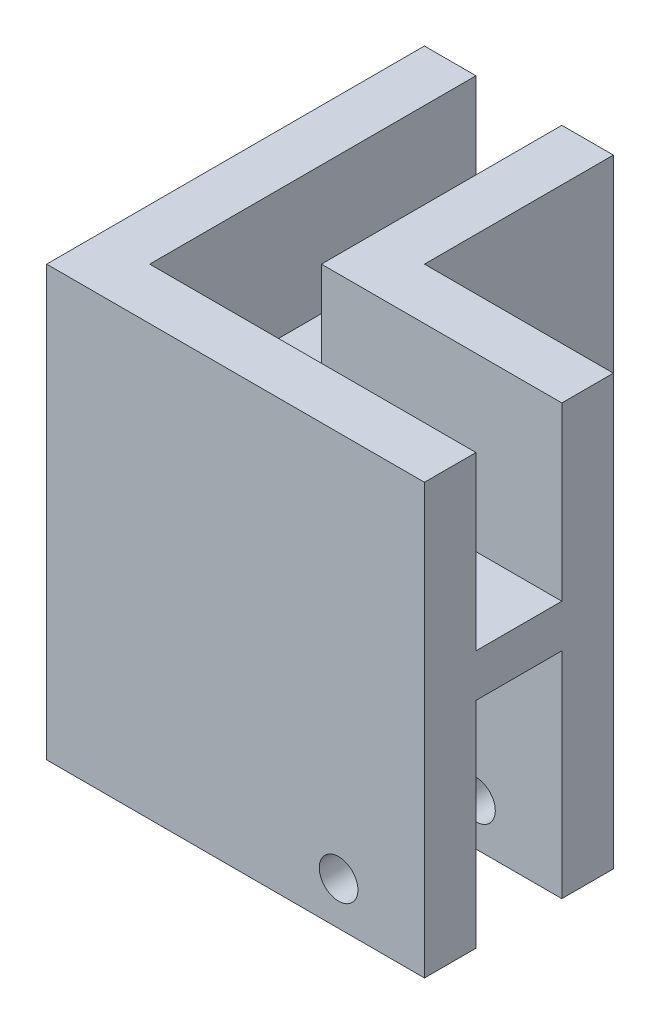
ISO-10303-21;
HEADER;
FILE_DESCRIPTION(('STEP AP214'),'2;1');
FILE_NAME('part.step','',(''),(''),'','','');
FILE_SCHEMA(('AUTOMOTIVE_DESIGN { 1 0 10303 214 1 1 1 1 }'));
ENDSEC;
DATA;
#1=APPLICATION_CONTEXT('core data for automotive mechanical design processes');
#2=APPLICATION_PROTOCOL_DEFINITION('international standard','automotive_design',2000,#1);
#3=PRODUCT_CONTEXT('',#1,'mechanical');
#4=PRODUCT('Part','Part','',(#3));
#5=PRODUCT_RELATED_PRODUCT_CATEGORY('part','',(#4));
#6=PRODUCT_DEFINITION_FORMATION('','',#4);
#7=PRODUCT_DEFINITION_CONTEXT('part definition',#1,'design');
#8=PRODUCT_DEFINITION('design','',#6,#7);
#9=PRODUCT_DEFINITION_SHAPE('','',#8);
#10=(LENGTH_UNIT() NAMED_UNIT(*) SI_UNIT(.MILLI.,.METRE.));
#11=(NAMED_UNIT(*) PLANE_ANGLE_UNIT() SI_UNIT($,.RADIAN.));
#12=(NAMED_UNIT(*) SI_UNIT($,.STERADIAN.) SOLID_ANGLE_UNIT());
#13=UNCERTAINTY_MEASURE_WITH_UNIT(LENGTH_MEASURE(1.E-05),#10,'distance_accuracy_value','');
#14=(GEOMETRIC_REPRESENTATION_CONTEXT(3) GLOBAL_UNCERTAINTY_ASSIGNED_CONTEXT((#13)) GLOBAL_UNIT_ASSIGNED_CONTEXT((#10,
#11,#12)) REPRESENTATION_CONTEXT('',''));
#15=CARTESIAN_POINT('',(0.,0.,0.));
#16=DIRECTION('',(0.,0.,1.));
#17=DIRECTION('',(1.,0.,0.));
#18=AXIS2_PLACEMENT_3D('',#15,#16,#17);
#19=CARTESIAN_POINT('',(-10.,10.,28.));
#20=DIRECTION('',(0.,-1.,0.));
#21=DIRECTION('',(0.,0.,-1.));
#22=AXIS2_PLACEMENT_3D('',#19,#20,#21);
#23=PLANE('',#22);
#24=DIRECTION('',(0.,0.,1.));
#25=VECTOR('',#24,1.);
#26=CARTESIAN_POINT('',(0.,10.,38.));
#27=LINE('',#26,#25);
#28=CARTESIAN_POINT('',(0.,10.,28.));
#29=VERTEX_POINT('',#28);
#30=CARTESIAN_POINT('',(0.,10.,38.));
#31=VERTEX_POINT('',#30);
#32=EDGE_CURVE('E302',#29,#31,#27,.T.);
#33=ORIENTED_EDGE('',*,*,#32,.F.);
#34=DIRECTION('',(0.,0.,-1.));
#35=VECTOR('',#34,1.);
#36=CARTESIAN_POINT('',(0.,10.,28.));
#37=LINE('',#36,#35);
#38=CARTESIAN_POINT('',(0.,10.,0.));
#39=VERTEX_POINT('',#38);
#40=EDGE_CURVE('E176',#29,#39,#37,.T.);
#41=ORIENTED_EDGE('',*,*,#40,.T.);
#42=DIRECTION('',(-1.,0.,0.));
#43=VECTOR('',#42,1.);
#44=CARTESIAN_POINT('',(-10.,10.,0.));
#45=LINE('',#44,#43);
#46=CARTESIAN_POINT('',(-10.,10.,0.));
#47=VERTEX_POINT('',#46);
#48=EDGE_CURVE('E149',#39,#47,#45,.T.);
#49=ORIENTED_EDGE('',*,*,#48,.T.);
#50=DIRECTION('',(0.,0.,-1.));
#51=VECTOR('',#50,1.);
#52=CARTESIAN_POINT('',(-10.,10.,28.));
#53=LINE('',#52,#51);
#54=CARTESIAN_POINT('',(-10.,10.,38.));
#55=VERTEX_POINT('',#54);
#56=EDGE_CURVE('E173',#55,#47,#53,.T.);
#57=ORIENTED_EDGE('',*,*,#56,.F.);
#58=DIRECTION('',(1.,0.,0.));
#59=VECTOR('',#58,1.);
#60=CARTESIAN_POINT('',(-10.,10.,38.));
#61=LINE('',#60,#59);
#62=EDGE_CURVE('E264',#55,#31,#61,.T.);
#63=ORIENTED_EDGE('',*,*,#62,.T.);
#64=EDGE_LOOP('',(#33,#41,#49,#57,#63));
#65=FACE_BOUND('',#64,.T.);
#66=ADVANCED_FACE('F37',(#65),#23,.F.);
#67=CARTESIAN_POINT('',(6.,25.,28.));
#68=DIRECTION('',(-1.,0.,0.));
#69=DIRECTION('',(0.,-1.,0.));
#70=AXIS2_PLACEMENT_3D('',#67,#68,#69);
#71=PLANE('',#70);
#72=CARTESIAN_POINT('',(6.00000000000001,-20.,10.));
#73=DIRECTION('',(-1.,0.,0.));
#74=DIRECTION('',(0.,-1.,0.));
#75=AXIS2_PLACEMENT_3D('',#72,#73,#74);
#76=CIRCLE('',#75,2.24999999999999);
#77=CARTESIAN_POINT('',(6.00000000000001,-22.25,10.));
#78=VERTEX_POINT('',#77);
#79=EDGE_CURVE('E196',#78,#78,#76,.T.);
#80=ORIENTED_EDGE('',*,*,#79,.T.);
#81=EDGE_LOOP('',(#80));
#82=FACE_BOUND('',#81,.T.);
#83=DIRECTION('',(0.,1.,0.));
#84=VECTOR('',#83,1.);
#85=CARTESIAN_POINT('',(6.,25.,22.));
#86=LINE('',#85,#84);
#87=CARTESIAN_POINT('',(6.,-25.,22.));
#88=VERTEX_POINT('',#87);
#89=CARTESIAN_POINT('',(6.,25.,22.));
#90=VERTEX_POINT('',#89);
#91=EDGE_CURVE('E54',#88,#90,#86,.T.);
#92=ORIENTED_EDGE('',*,*,#91,.F.);
#93=DIRECTION('',(0.,0.,-1.));
#94=VECTOR('',#93,1.);
#95=CARTESIAN_POINT('',(6.,-25.,28.));
#96=LINE('',#95,#94);
#97=CARTESIAN_POINT('',(6.,-25.,0.));
#98=VERTEX_POINT('',#97);
#99=EDGE_CURVE('E184',#88,#98,#96,.T.);
#100=ORIENTED_EDGE('',*,*,#99,.T.);
#101=DIRECTION('',(0.,1.,0.));
#102=VECTOR('',#101,1.);
#103=CARTESIAN_POINT('',(6.,25.,0.));
#104=LINE('',#103,#102);
#105=CARTESIAN_POINT('',(6.,25.,0.));
#106=VERTEX_POINT('',#105);
#107=EDGE_CURVE('E135',#98,#106,#104,.T.);
#108=ORIENTED_EDGE('',*,*,#107,.T.);
#109=DIRECTION('',(0.,0.,-1.));
#110=VECTOR('',#109,1.);
#111=CARTESIAN_POINT('',(6.,25.,28.));
#112=LINE('',#111,#110);
#113=EDGE_CURVE('E182',#90,#106,#112,.T.);
#114=ORIENTED_EDGE('',*,*,#113,.F.);
#115=EDGE_LOOP('',(#92,#100,#108,#114));
#116=FACE_BOUND('',#115,.T.);
#117=ADVANCED_FACE('F431',(#82,#116),#71,.F.);
#118=CARTESIAN_POINT('',(0.,0.,28.));
#119=DIRECTION('',(0.,0.,1.));
#120=DIRECTION('',(1.,0.,0.));
#121=AXIS2_PLACEMENT_3D('',#118,#119,#120);
#122=PLANE('',#121);
#123=DIRECTION('',(0.,1.,0.));
#124=VECTOR('',#123,1.);
#125=CARTESIAN_POINT('',(0.,10.,28.));
#126=LINE('',#125,#124);
#127=CARTESIAN_POINT('',(0.,5.,28.));
#128=VERTEX_POINT('',#127);
#129=EDGE_CURVE('E290',#128,#29,#126,.T.);
#130=ORIENTED_EDGE('',*,*,#129,.F.);
#131=DIRECTION('',(-1.,0.,0.));
#132=VECTOR('',#131,1.);
#133=CARTESIAN_POINT('',(28.,5.00000000000001,28.));
#134=LINE('',#133,#132);
#135=CARTESIAN_POINT('',(28.,5.00000000000001,28.));
#136=VERTEX_POINT('',#135);
#137=EDGE_CURVE('E247',#136,#128,#134,.T.);
#138=ORIENTED_EDGE('',*,*,#137,.F.);
#139=DIRECTION('',(0.,-1.,0.));
#140=VECTOR('',#139,1.);
#141=CARTESIAN_POINT('',(28.,5.00000000000001,28.));
#142=LINE('',#141,#140);
#143=CARTESIAN_POINT('',(28.,25.,28.));
#144=VERTEX_POINT('',#143);
#145=EDGE_CURVE('E225',#144,#136,#142,.T.);
#146=ORIENTED_EDGE('',*,*,#145,.F.);
#147=DIRECTION('',(-1.,0.,0.));
#148=VECTOR('',#147,1.);
#149=CARTESIAN_POINT('',(0.,25.,28.));
#150=LINE('',#149,#148);
#151=CARTESIAN_POINT('',(0.,25.,28.));
#152=VERTEX_POINT('',#151);
#153=EDGE_CURVE('E63',#144,#152,#150,.T.);
#154=ORIENTED_EDGE('',*,*,#153,.T.);
#155=DIRECTION('',(0.,-1.,0.));
#156=VECTOR('',#155,1.);
#157=CARTESIAN_POINT('',(0.,10.,28.));
#158=LINE('',#157,#156);
#159=EDGE_CURVE('E126',#152,#29,#158,.T.);
#160=ORIENTED_EDGE('',*,*,#159,.T.);
#161=EDGE_LOOP('',(#130,#138,#146,#154,#160));
#162=FACE_BOUND('',#161,.T.);
#163=ADVANCED_FACE('F286',(#162),#122,.T.);
#164=CARTESIAN_POINT('',(0.,-25.,28.));
#165=DIRECTION('',(1.,0.,0.));
#166=DIRECTION('',(0.,0.,-1.));
#167=AXIS2_PLACEMENT_3D('',#164,#165,#166);
#168=PLANE('',#167);
#169=CARTESIAN_POINT('',(0.,-20.,10.));
#170=DIRECTION('',(1.,0.,0.));
#171=DIRECTION('',(0.,0.,-1.));
#172=AXIS2_PLACEMENT_3D('',#169,#170,#171);
#173=CIRCLE('',#172,2.24999999999999);
#174=CARTESIAN_POINT('',(0.,-20.,7.75000000000001));
#175=VERTEX_POINT('',#174);
#176=EDGE_CURVE('E201',#175,#175,#173,.T.);
#177=ORIENTED_EDGE('',*,*,#176,.T.);
#178=EDGE_LOOP('',(#177));
#179=FACE_BOUND('',#178,.T.);
#180=DIRECTION('',(0.,-1.,0.));
#181=VECTOR('',#180,1.);
#182=CARTESIAN_POINT('',(0.,-25.,0.));
#183=LINE('',#182,#181);
#184=CARTESIAN_POINT('',(0.,0.,0.));
#185=VERTEX_POINT('',#184);
#186=CARTESIAN_POINT('',(0.,-25.,0.));
#187=VERTEX_POINT('',#186);
#188=EDGE_CURVE('E124',#185,#187,#183,.T.);
#189=ORIENTED_EDGE('',*,*,#188,.T.);
#190=DIRECTION('',(0.,0.,-1.));
#191=VECTOR('',#190,1.);
#192=CARTESIAN_POINT('',(0.,-25.,28.));
#193=LINE('',#192,#191);
#194=CARTESIAN_POINT('',(0.,-25.,28.));
#195=VERTEX_POINT('',#194);
#196=EDGE_CURVE('E46',#195,#187,#193,.T.);
#197=ORIENTED_EDGE('',*,*,#196,.F.);
#198=DIRECTION('',(0.,-1.,0.));
#199=VECTOR('',#198,1.);
#200=CARTESIAN_POINT('',(0.,-25.,28.));
#201=LINE('',#200,#199);
#202=CARTESIAN_POINT('',(0.,0.,28.));
#203=VERTEX_POINT('',#202);
#204=EDGE_CURVE('E118',#203,#195,#201,.T.);
#205=ORIENTED_EDGE('',*,*,#204,.F.);
#206=DIRECTION('',(0.,0.,-1.));
#207=VECTOR('',#206,1.);
#208=CARTESIAN_POINT('',(0.,0.,28.));
#209=LINE('',#208,#207);
#210=EDGE_CURVE('E110',#203,#185,#209,.T.);
#211=ORIENTED_EDGE('',*,*,#210,.T.);
#212=EDGE_LOOP('',(#189,#197,#205,#211));
#213=FACE_BOUND('',#212,.T.);
#214=ADVANCED_FACE('F39',(#179,#213),#168,.F.);
#215=CARTESIAN_POINT('',(6.,-25.,28.));
#216=DIRECTION('',(0.,1.,0.));
#217=DIRECTION('',(0.,0.,1.));
#218=AXIS2_PLACEMENT_3D('',#215,#216,#217);
#219=PLANE('',#218);
#220=DIRECTION('',(1.,0.,0.));
#221=VECTOR('',#220,1.);
#222=CARTESIAN_POINT('',(6.,-25.,0.));
#223=LINE('',#222,#221);
#224=EDGE_CURVE('E131',#187,#98,#223,.T.);
#225=ORIENTED_EDGE('',*,*,#224,.T.);
#226=ORIENTED_EDGE('',*,*,#99,.F.);
#227=DIRECTION('',(-1.,0.,0.));
#228=VECTOR('',#227,1.);
#229=CARTESIAN_POINT('',(28.,-25.,22.));
#230=LINE('',#229,#228);
#231=CARTESIAN_POINT('',(28.,-25.,22.));
#232=VERTEX_POINT('',#231);
#233=EDGE_CURVE('E253',#232,#88,#230,.T.);
#234=ORIENTED_EDGE('',*,*,#233,.F.);
#235=DIRECTION('',(0.,0.,-1.));
#236=VECTOR('',#235,1.);
#237=CARTESIAN_POINT('',(28.,-25.,22.));
#238=LINE('',#237,#236);
#239=CARTESIAN_POINT('',(28.,-25.,28.));
#240=VERTEX_POINT('',#239);
#241=EDGE_CURVE('E216',#240,#232,#238,.T.);
#242=ORIENTED_EDGE('',*,*,#241,.F.);
#243=DIRECTION('',(1.,0.,0.));
#244=VECTOR('',#243,1.);
#245=CARTESIAN_POINT('',(6.,-25.,28.));
#246=LINE('',#245,#244);
#247=EDGE_CURVE('E280',#195,#240,#246,.T.);
#248=ORIENTED_EDGE('',*,*,#247,.F.);
#249=ORIENTED_EDGE('',*,*,#196,.T.);
#250=EDGE_LOOP('',(#225,#226,#234,#242,#248,#249));
#251=FACE_BOUND('',#250,.T.);
#252=ADVANCED_FACE('F447',(#251),#219,.F.);
#253=CARTESIAN_POINT('',(0.,25.,28.));
#254=DIRECTION('',(0.,-1.,0.));
#255=DIRECTION('',(0.,0.,-1.));
#256=AXIS2_PLACEMENT_3D('',#253,#254,#255);
#257=PLANE('',#256);
#258=DIRECTION('',(-1.,0.,0.));
#259=VECTOR('',#258,1.);
#260=CARTESIAN_POINT('',(0.,25.,0.));
#261=LINE('',#260,#259);
#262=CARTESIAN_POINT('',(0.,25.,0.));
#263=VERTEX_POINT('',#262);
#264=EDGE_CURVE('E145',#106,#263,#261,.T.);
#265=ORIENTED_EDGE('',*,*,#264,.T.);
#266=DIRECTION('',(0.,0.,-1.));
#267=VECTOR('',#266,1.);
#268=CARTESIAN_POINT('',(0.,25.,28.));
#269=LINE('',#268,#267);
#270=EDGE_CURVE('E179',#152,#263,#269,.T.);
#271=ORIENTED_EDGE('',*,*,#270,.F.);
#272=ORIENTED_EDGE('',*,*,#153,.F.);
#273=DIRECTION('',(0.,0.,1.));
#274=VECTOR('',#273,1.);
#275=CARTESIAN_POINT('',(28.,25.,28.));
#276=LINE('',#275,#274);
#277=CARTESIAN_POINT('',(28.,25.,22.));
#278=VERTEX_POINT('',#277);
#279=EDGE_CURVE('E222',#278,#144,#276,.T.);
#280=ORIENTED_EDGE('',*,*,#279,.F.);
#281=DIRECTION('',(-1.,0.,0.));
#282=VECTOR('',#281,1.);
#283=CARTESIAN_POINT('',(28.,25.,22.));
#284=LINE('',#283,#282);
#285=EDGE_CURVE('E250',#278,#90,#284,.T.);
#286=ORIENTED_EDGE('',*,*,#285,.T.);
#287=ORIENTED_EDGE('',*,*,#113,.T.);
#288=EDGE_LOOP('',(#265,#271,#272,#280,#286,#287));
#289=FACE_BOUND('',#288,.T.);
#290=ADVANCED_FACE('F445',(#289),#257,.F.);
#291=CARTESIAN_POINT('',(0.,10.,28.));
#292=DIRECTION('',(1.,0.,0.));
#293=DIRECTION('',(0.,1.,0.));
#294=AXIS2_PLACEMENT_3D('',#291,#292,#293);
#295=PLANE('',#294);
#296=DIRECTION('',(0.,-1.,0.));
#297=VECTOR('',#296,1.);
#298=CARTESIAN_POINT('',(0.,10.,0.));
#299=LINE('',#298,#297);
#300=EDGE_CURVE('E147',#263,#39,#299,.T.);
#301=ORIENTED_EDGE('',*,*,#300,.T.);
#302=ORIENTED_EDGE('',*,*,#40,.F.);
#303=ORIENTED_EDGE('',*,*,#159,.F.);
#304=ORIENTED_EDGE('',*,*,#270,.T.);
#305=EDGE_LOOP('',(#301,#302,#303,#304));
#306=FACE_BOUND('',#305,.T.);
#307=ADVANCED_FACE('F295',(#306),#295,.F.);
#308=CARTESIAN_POINT('',(-10.,25.,28.));
#309=DIRECTION('',(-1.,0.,0.));
#310=DIRECTION('',(0.,-1.,0.));
#311=AXIS2_PLACEMENT_3D('',#308,#309,#310);
#312=PLANE('',#311);
#313=DIRECTION('',(0.,1.,0.));
#314=VECTOR('',#313,1.);
#315=CARTESIAN_POINT('',(-10.,25.,0.));
#316=LINE('',#315,#314);
#317=CARTESIAN_POINT('',(-10.,25.,0.));
#318=VERTEX_POINT('',#317);
#319=EDGE_CURVE('E151',#47,#318,#316,.T.);
#320=ORIENTED_EDGE('',*,*,#319,.T.);
#321=DIRECTION('',(0.,0.,-1.));
#322=VECTOR('',#321,1.);
#323=CARTESIAN_POINT('',(-10.,25.,28.));
#324=LINE('',#323,#322);
#325=CARTESIAN_POINT('',(-10.,25.,38.));
#326=VERTEX_POINT('',#325);
#327=EDGE_CURVE('E170',#326,#318,#324,.T.);
#328=ORIENTED_EDGE('',*,*,#327,.F.);
#329=DIRECTION('',(0.,1.,0.));
#330=VECTOR('',#329,1.);
#331=CARTESIAN_POINT('',(-10.,25.,38.));
#332=LINE('',#331,#330);
#333=EDGE_CURVE('E259',#55,#326,#332,.T.);
#334=ORIENTED_EDGE('',*,*,#333,.F.);
#335=ORIENTED_EDGE('',*,*,#56,.T.);
#336=EDGE_LOOP('',(#320,#328,#334,#335));
#337=FACE_BOUND('',#336,.T.);
#338=ADVANCED_FACE('F309',(#337),#312,.F.);
#339=CARTESIAN_POINT('',(-16.,25.,28.));
#340=DIRECTION('',(0.,-1.,0.));
#341=DIRECTION('',(0.,0.,-1.));
#342=AXIS2_PLACEMENT_3D('',#339,#340,#341);
#343=PLANE('',#342);
#344=DIRECTION('',(-1.,0.,0.));
#345=VECTOR('',#344,1.);
#346=CARTESIAN_POINT('',(-16.,25.,0.));
#347=LINE('',#346,#345);
#348=CARTESIAN_POINT('',(-16.,25.,0.));
#349=VERTEX_POINT('',#348);
#350=EDGE_CURVE('E153',#318,#349,#347,.T.);
#351=ORIENTED_EDGE('',*,*,#350,.T.);
#352=DIRECTION('',(0.,0.,-1.));
#353=VECTOR('',#352,1.);
#354=CARTESIAN_POINT('',(-16.,25.,28.));
#355=LINE('',#354,#353);
#356=CARTESIAN_POINT('',(-16.,25.,44.));
#357=VERTEX_POINT('',#356);
#358=EDGE_CURVE('E167',#357,#349,#355,.T.);
#359=ORIENTED_EDGE('',*,*,#358,.F.);
#360=DIRECTION('',(1.,0.,0.));
#361=VECTOR('',#360,1.);
#362=CARTESIAN_POINT('',(-10.,25.,44.));
#363=LINE('',#362,#361);
#364=CARTESIAN_POINT('',(28.,25.,44.));
#365=VERTEX_POINT('',#364);
#366=EDGE_CURVE('E271',#357,#365,#363,.T.);
#367=ORIENTED_EDGE('',*,*,#366,.T.);
#368=DIRECTION('',(0.,0.,1.));
#369=VECTOR('',#368,1.);
#370=CARTESIAN_POINT('',(28.,25.,44.));
#371=LINE('',#370,#369);
#372=CARTESIAN_POINT('',(28.,25.,38.));
#373=VERTEX_POINT('',#372);
#374=EDGE_CURVE('E234',#373,#365,#371,.T.);
#375=ORIENTED_EDGE('',*,*,#374,.F.);
#376=DIRECTION('',(1.,0.,0.));
#377=VECTOR('',#376,1.);
#378=CARTESIAN_POINT('',(-10.,25.,38.));
#379=LINE('',#378,#377);
#380=EDGE_CURVE('E274',#326,#373,#379,.T.);
#381=ORIENTED_EDGE('',*,*,#380,.F.);
#382=ORIENTED_EDGE('',*,*,#327,.T.);
#383=EDGE_LOOP('',(#351,#359,#367,#375,#381,#382));
#384=FACE_BOUND('',#383,.T.);
#385=ADVANCED_FACE('F314',(#384),#343,.F.);
#386=CARTESIAN_POINT('',(-16.,-25.,28.));
#387=DIRECTION('',(1.,0.,0.));
#388=DIRECTION('',(0.,1.,0.));
#389=AXIS2_PLACEMENT_3D('',#386,#387,#388);
#390=PLANE('',#389);
#391=CARTESIAN_POINT('',(-16.,-20.,10.));
#392=DIRECTION('',(-1.,0.,0.));
#393=DIRECTION('',(0.,0.,1.));
#394=AXIS2_PLACEMENT_3D('',#391,#392,#393);
#395=CIRCLE('',#394,2.24999999999999);
#396=CARTESIAN_POINT('',(-16.,-20.,12.25));
#397=VERTEX_POINT('',#396);
#398=EDGE_CURVE('E404',#397,#397,#395,.T.);
#399=ORIENTED_EDGE('',*,*,#398,.F.);
#400=EDGE_LOOP('',(#399));
#401=FACE_BOUND('',#400,.T.);
#402=DIRECTION('',(0.,-1.,0.));
#403=VECTOR('',#402,1.);
#404=CARTESIAN_POINT('',(-16.,-25.,0.));
#405=LINE('',#404,#403);
#406=CARTESIAN_POINT('',(-16.,-25.,0.));
#407=VERTEX_POINT('',#406);
#408=EDGE_CURVE('E155',#349,#407,#405,.T.);
#409=ORIENTED_EDGE('',*,*,#408,.T.);
#410=DIRECTION('',(0.,0.,-1.));
#411=VECTOR('',#410,1.);
#412=CARTESIAN_POINT('',(-16.,-25.,28.));
#413=LINE('',#412,#411);
#414=CARTESIAN_POINT('',(-16.,-25.,44.));
#415=VERTEX_POINT('',#414);
#416=EDGE_CURVE('E164',#415,#407,#413,.T.);
#417=ORIENTED_EDGE('',*,*,#416,.F.);
#418=DIRECTION('',(0.,1.,0.));
#419=VECTOR('',#418,1.);
#420=CARTESIAN_POINT('',(-16.,25.,44.));
#421=LINE('',#420,#419);
#422=EDGE_CURVE('E256',#415,#357,#421,.T.);
#423=ORIENTED_EDGE('',*,*,#422,.T.);
#424=ORIENTED_EDGE('',*,*,#358,.T.);
#425=EDGE_LOOP('',(#409,#417,#423,#424));
#426=FACE_BOUND('',#425,.T.);
#427=ADVANCED_FACE('F369',(#401,#426),#390,.F.);
#428=CARTESIAN_POINT('',(-9.99999999999999,-25.,28.));
#429=DIRECTION('',(0.,1.,0.));
#430=DIRECTION('',(-1.,0.,0.));
#431=AXIS2_PLACEMENT_3D('',#428,#429,#430);
#432=PLANE('',#431);
#433=DIRECTION('',(1.,0.,0.));
#434=VECTOR('',#433,1.);
#435=CARTESIAN_POINT('',(-9.99999999999999,-25.,0.));
#436=LINE('',#435,#434);
#437=CARTESIAN_POINT('',(-9.99999999999999,-25.,0.));
#438=VERTEX_POINT('',#437);
#439=EDGE_CURVE('E157',#407,#438,#436,.T.);
#440=ORIENTED_EDGE('',*,*,#439,.T.);
#441=DIRECTION('',(0.,0.,-1.));
#442=VECTOR('',#441,1.);
#443=CARTESIAN_POINT('',(-9.99999999999999,-25.,28.));
#444=LINE('',#443,#442);
#445=CARTESIAN_POINT('',(-9.99999999999999,-25.,38.));
#446=VERTEX_POINT('',#445);
#447=EDGE_CURVE('E161',#446,#438,#444,.T.);
#448=ORIENTED_EDGE('',*,*,#447,.F.);
#449=DIRECTION('',(1.,0.,0.));
#450=VECTOR('',#449,1.);
#451=CARTESIAN_POINT('',(-10.,-25.,38.));
#452=LINE('',#451,#450);
#453=CARTESIAN_POINT('',(28.,-25.,38.));
#454=VERTEX_POINT('',#453);
#455=EDGE_CURVE('E138',#446,#454,#452,.T.);
#456=ORIENTED_EDGE('',*,*,#455,.T.);
#457=DIRECTION('',(0.,0.,-1.));
#458=VECTOR('',#457,1.);
#459=CARTESIAN_POINT('',(28.,-25.,38.));
#460=LINE('',#459,#458);
#461=CARTESIAN_POINT('',(28.,-25.,44.));
#462=VERTEX_POINT('',#461);
#463=EDGE_CURVE('E240',#462,#454,#460,.T.);
#464=ORIENTED_EDGE('',*,*,#463,.F.);
#465=DIRECTION('',(1.,0.,0.));
#466=VECTOR('',#465,1.);
#467=CARTESIAN_POINT('',(-10.,-25.,44.));
#468=LINE('',#467,#466);
#469=EDGE_CURVE('E268',#415,#462,#468,.T.);
#470=ORIENTED_EDGE('',*,*,#469,.F.);
#471=ORIENTED_EDGE('',*,*,#416,.T.);
#472=EDGE_LOOP('',(#440,#448,#456,#464,#470,#471));
#473=FACE_BOUND('',#472,.T.);
#474=ADVANCED_FACE('F372',(#473),#432,.F.);
#475=CARTESIAN_POINT('',(-10.,0.,28.));
#476=DIRECTION('',(-1.,0.,0.));
#477=DIRECTION('',(0.,-1.,0.));
#478=AXIS2_PLACEMENT_3D('',#475,#476,#477);
#479=PLANE('',#478);
#480=CARTESIAN_POINT('',(-9.99999999999999,-20.,10.));
#481=DIRECTION('',(-1.,0.,0.));
#482=DIRECTION('',(0.,-1.,0.));
#483=AXIS2_PLACEMENT_3D('',#480,#481,#482);
#484=CIRCLE('',#483,2.24999999999999);
#485=CARTESIAN_POINT('',(-9.99999999999999,-22.25,10.));
#486=VERTEX_POINT('',#485);
#487=EDGE_CURVE('E41',#486,#486,#484,.T.);
#488=ORIENTED_EDGE('',*,*,#487,.T.);
#489=EDGE_LOOP('',(#488));
#490=FACE_BOUND('',#489,.T.);
#491=DIRECTION('',(0.,1.,0.));
#492=VECTOR('',#491,1.);
#493=CARTESIAN_POINT('',(-10.,0.,0.));
#494=LINE('',#493,#492);
#495=CARTESIAN_POINT('',(-10.,0.,0.));
#496=VERTEX_POINT('',#495);
#497=EDGE_CURVE('E119',#438,#496,#494,.T.);
#498=ORIENTED_EDGE('',*,*,#497,.T.);
#499=DIRECTION('',(0.,0.,-1.));
#500=VECTOR('',#499,1.);
#501=CARTESIAN_POINT('',(-10.,0.,28.));
#502=LINE('',#501,#500);
#503=CARTESIAN_POINT('',(-10.,0.,38.));
#504=VERTEX_POINT('',#503);
#505=EDGE_CURVE('E114',#504,#496,#502,.T.);
#506=ORIENTED_EDGE('',*,*,#505,.F.);
#507=DIRECTION('',(0.,1.,0.));
#508=VECTOR('',#507,1.);
#509=CARTESIAN_POINT('',(-10.,0.,38.));
#510=LINE('',#509,#508);
#511=EDGE_CURVE('E262',#446,#504,#510,.T.);
#512=ORIENTED_EDGE('',*,*,#511,.F.);
#513=ORIENTED_EDGE('',*,*,#447,.T.);
#514=EDGE_LOOP('',(#498,#506,#512,#513));
#515=FACE_BOUND('',#514,.T.);
#516=ADVANCED_FACE('F412',(#490,#515),#479,.F.);
#517=CARTESIAN_POINT('',(0.,0.,28.));
#518=DIRECTION('',(0.,1.,0.));
#519=DIRECTION('',(0.,0.,1.));
#520=AXIS2_PLACEMENT_3D('',#517,#518,#519);
#521=PLANE('',#520);
#522=DIRECTION('',(1.,0.,0.));
#523=VECTOR('',#522,1.);
#524=CARTESIAN_POINT('',(0.,0.,0.));
#525=LINE('',#524,#523);
#526=EDGE_CURVE('E107',#496,#185,#525,.T.);
#527=ORIENTED_EDGE('',*,*,#526,.T.);
#528=ORIENTED_EDGE('',*,*,#210,.F.);
#529=DIRECTION('',(1.,0.,0.));
#530=VECTOR('',#529,1.);
#531=CARTESIAN_POINT('',(-10.,0.,28.));
#532=LINE('',#531,#530);
#533=CARTESIAN_POINT('',(28.,0.,28.));
#534=VERTEX_POINT('',#533);
#535=EDGE_CURVE('E11',#203,#534,#532,.T.);
#536=ORIENTED_EDGE('',*,*,#535,.T.);
#537=DIRECTION('',(0.,0.,-1.));
#538=VECTOR('',#537,1.);
#539=CARTESIAN_POINT('',(28.,0.,28.));
#540=LINE('',#539,#538);
#541=CARTESIAN_POINT('',(28.,0.,38.));
#542=VERTEX_POINT('',#541);
#543=EDGE_CURVE('E210',#542,#534,#540,.T.);
#544=ORIENTED_EDGE('',*,*,#543,.F.);
#545=DIRECTION('',(1.,0.,0.));
#546=VECTOR('',#545,1.);
#547=CARTESIAN_POINT('',(-10.,0.,38.));
#548=LINE('',#547,#546);
#549=EDGE_CURVE('E133',#504,#542,#548,.T.);
#550=ORIENTED_EDGE('',*,*,#549,.F.);
#551=ORIENTED_EDGE('',*,*,#505,.T.);
#552=EDGE_LOOP('',(#527,#528,#536,#544,#550,#551));
#553=FACE_BOUND('',#552,.T.);
#554=ADVANCED_FACE('F109',(#553),#521,.F.);
#555=CARTESIAN_POINT('',(18.,-20.,28.));
#556=DIRECTION('',(0.,0.,1.));
#557=DIRECTION('',(1.,0.,0.));
#558=AXIS2_PLACEMENT_3D('',#555,#556,#557);
#559=CIRCLE('',#558,2.24999999999999);
#560=CARTESIAN_POINT('',(20.25,-20.,28.));
#561=VERTEX_POINT('',#560);
#562=EDGE_CURVE('E193',#561,#561,#559,.T.);
#563=ORIENTED_EDGE('',*,*,#562,.F.);
#564=EDGE_LOOP('',(#563));
#565=FACE_BOUND('',#564,.T.);
#566=ORIENTED_EDGE('',*,*,#535,.F.);
#567=ORIENTED_EDGE('',*,*,#204,.T.);
#568=ORIENTED_EDGE('',*,*,#247,.T.);
#569=DIRECTION('',(0.,-1.,0.));
#570=VECTOR('',#569,1.);
#571=CARTESIAN_POINT('',(28.,-25.,28.));
#572=LINE('',#571,#570);
#573=EDGE_CURVE('E213',#534,#240,#572,.T.);
#574=ORIENTED_EDGE('',*,*,#573,.F.);
#575=EDGE_LOOP('',(#566,#567,#568,#574));
#576=FACE_BOUND('',#575,.T.);
#577=ADVANCED_FACE('F335',(#565,#576),#122,.T.);
#578=CARTESIAN_POINT('',(0.,0.,0.));
#579=DIRECTION('',(0.,0.,1.));
#580=DIRECTION('',(1.,0.,0.));
#581=AXIS2_PLACEMENT_3D('',#578,#579,#580);
#582=PLANE('',#581);
#583=ORIENTED_EDGE('',*,*,#188,.F.);
#584=ORIENTED_EDGE('',*,*,#526,.F.);
#585=ORIENTED_EDGE('',*,*,#497,.F.);
#586=ORIENTED_EDGE('',*,*,#439,.F.);
#587=ORIENTED_EDGE('',*,*,#408,.F.);
#588=ORIENTED_EDGE('',*,*,#350,.F.);
#589=ORIENTED_EDGE('',*,*,#319,.F.);
#590=ORIENTED_EDGE('',*,*,#48,.F.);
#591=ORIENTED_EDGE('',*,*,#300,.F.);
#592=ORIENTED_EDGE('',*,*,#264,.F.);
#593=ORIENTED_EDGE('',*,*,#107,.F.);
#594=ORIENTED_EDGE('',*,*,#224,.F.);
#595=EDGE_LOOP('',(#583,#584,#585,#586,#587,#588,#589,#590,#591,#592,#593,#594));
#596=FACE_BOUND('',#595,.T.);
#597=ADVANCED_FACE('F128',(#596),#582,.F.);
#598=CARTESIAN_POINT('',(-10.,0.,38.));
#599=DIRECTION('',(0.,0.,-1.));
#600=DIRECTION('',(-1.,0.,0.));
#601=AXIS2_PLACEMENT_3D('',#598,#599,#600);
#602=PLANE('',#601);
#603=CARTESIAN_POINT('',(18.,-20.,38.));
#604=DIRECTION('',(0.,0.,-1.));
#605=DIRECTION('',(-1.,0.,0.));
#606=AXIS2_PLACEMENT_3D('',#603,#604,#605);
#607=CIRCLE('',#606,2.24999999999999);
#608=CARTESIAN_POINT('',(15.75,-20.,38.));
#609=VERTEX_POINT('',#608);
#610=EDGE_CURVE('E188',#609,#609,#607,.T.);
#611=ORIENTED_EDGE('',*,*,#610,.F.);
#612=EDGE_LOOP('',(#611));
#613=FACE_BOUND('',#612,.T.);
#614=ORIENTED_EDGE('',*,*,#549,.T.);
#615=DIRECTION('',(0.,1.,0.));
#616=VECTOR('',#615,1.);
#617=CARTESIAN_POINT('',(28.,0.,38.));
#618=LINE('',#617,#616);
#619=EDGE_CURVE('E207',#454,#542,#618,.T.);
#620=ORIENTED_EDGE('',*,*,#619,.F.);
#621=ORIENTED_EDGE('',*,*,#455,.F.);
#622=ORIENTED_EDGE('',*,*,#511,.T.);
#623=EDGE_LOOP('',(#614,#620,#621,#622));
#624=FACE_BOUND('',#623,.T.);
#625=ADVANCED_FACE('F351',(#613,#624),#602,.T.);
#626=CARTESIAN_POINT('',(-10.,-25.,44.));
#627=DIRECTION('',(0.,0.,1.));
#628=DIRECTION('',(0.,-1.,0.));
#629=AXIS2_PLACEMENT_3D('',#626,#627,#628);
#630=PLANE('',#629);
#631=CARTESIAN_POINT('',(18.,-20.,44.));
#632=DIRECTION('',(0.,0.,1.));
#633=DIRECTION('',(1.,0.,0.));
#634=AXIS2_PLACEMENT_3D('',#631,#632,#633);
#635=CIRCLE('',#634,2.24999999999999);
#636=CARTESIAN_POINT('',(20.25,-20.,44.));
#637=VERTEX_POINT('',#636);
#638=EDGE_CURVE('E189',#637,#637,#635,.T.);
#639=ORIENTED_EDGE('',*,*,#638,.F.);
#640=EDGE_LOOP('',(#639));
#641=FACE_BOUND('',#640,.T.);
#642=ORIENTED_EDGE('',*,*,#469,.T.);
#643=DIRECTION('',(0.,-1.,0.));
#644=VECTOR('',#643,1.);
#645=CARTESIAN_POINT('',(28.,-25.,44.));
#646=LINE('',#645,#644);
#647=EDGE_CURVE('E237',#365,#462,#646,.T.);
#648=ORIENTED_EDGE('',*,*,#647,.F.);
#649=ORIENTED_EDGE('',*,*,#366,.F.);
#650=ORIENTED_EDGE('',*,*,#422,.F.);
#651=EDGE_LOOP('',(#642,#648,#649,#650));
#652=FACE_BOUND('',#651,.T.);
#653=ADVANCED_FACE('F368',(#641,#652),#630,.T.);
#654=CARTESIAN_POINT('',(-10.,25.,38.));
#655=DIRECTION('',(0.,0.,-1.));
#656=DIRECTION('',(-1.,0.,0.));
#657=AXIS2_PLACEMENT_3D('',#654,#655,#656);
#658=PLANE('',#657);
#659=ORIENTED_EDGE('',*,*,#380,.T.);
#660=DIRECTION('',(0.,1.,0.));
#661=VECTOR('',#660,1.);
#662=CARTESIAN_POINT('',(28.,25.,38.));
#663=LINE('',#662,#661);
#664=CARTESIAN_POINT('',(28.,5.,38.));
#665=VERTEX_POINT('',#664);
#666=EDGE_CURVE('E231',#665,#373,#663,.T.);
#667=ORIENTED_EDGE('',*,*,#666,.F.);
#668=DIRECTION('',(-1.,0.,0.));
#669=VECTOR('',#668,1.);
#670=CARTESIAN_POINT('',(28.,5.,38.));
#671=LINE('',#670,#669);
#672=CARTESIAN_POINT('',(0.,5.,38.));
#673=VERTEX_POINT('',#672);
#674=EDGE_CURVE('E243',#665,#673,#671,.T.);
#675=ORIENTED_EDGE('',*,*,#674,.T.);
#676=DIRECTION('',(0.,-1.,0.));
#677=VECTOR('',#676,1.);
#678=CARTESIAN_POINT('',(0.,10.,38.));
#679=LINE('',#678,#677);
#680=EDGE_CURVE('E392',#31,#673,#679,.T.);
#681=ORIENTED_EDGE('',*,*,#680,.F.);
#682=ORIENTED_EDGE('',*,*,#62,.F.);
#683=ORIENTED_EDGE('',*,*,#333,.T.);
#684=EDGE_LOOP('',(#659,#667,#675,#681,#682,#683));
#685=FACE_BOUND('',#684,.T.);
#686=ADVANCED_FACE('F324',(#685),#658,.T.);
#687=CARTESIAN_POINT('',(28.,25.,22.));
#688=DIRECTION('',(0.,0.,1.));
#689=DIRECTION('',(0.,-1.,0.));
#690=AXIS2_PLACEMENT_3D('',#687,#688,#689);
#691=PLANE('',#690);
#692=CARTESIAN_POINT('',(18.,-20.,22.));
#693=DIRECTION('',(0.,0.,1.));
#694=DIRECTION('',(0.,-1.,0.));
#695=AXIS2_PLACEMENT_3D('',#692,#693,#694);
#696=CIRCLE('',#695,2.24999999999999);
#697=CARTESIAN_POINT('',(18.,-22.25,22.));
#698=VERTEX_POINT('',#697);
#699=EDGE_CURVE('E186',#698,#698,#696,.T.);
#700=ORIENTED_EDGE('',*,*,#699,.T.);
#701=EDGE_LOOP('',(#700));
#702=FACE_BOUND('',#701,.T.);
#703=ORIENTED_EDGE('',*,*,#91,.T.);
#704=ORIENTED_EDGE('',*,*,#285,.F.);
#705=DIRECTION('',(0.,1.,0.));
#706=VECTOR('',#705,1.);
#707=CARTESIAN_POINT('',(28.,25.,22.));
#708=LINE('',#707,#706);
#709=EDGE_CURVE('E219',#232,#278,#708,.T.);
#710=ORIENTED_EDGE('',*,*,#709,.F.);
#711=ORIENTED_EDGE('',*,*,#233,.T.);
#712=EDGE_LOOP('',(#703,#704,#710,#711));
#713=FACE_BOUND('',#712,.T.);
#714=ADVANCED_FACE('F457',(#702,#713),#691,.F.);
#715=CARTESIAN_POINT('',(28.,5.,38.));
#716=DIRECTION('',(0.,-1.,0.));
#717=DIRECTION('',(0.,0.,-1.));
#718=AXIS2_PLACEMENT_3D('',#715,#716,#717);
#719=PLANE('',#718);
#720=ORIENTED_EDGE('',*,*,#137,.T.);
#721=DIRECTION('',(0.,0.,-1.));
#722=VECTOR('',#721,1.);
#723=CARTESIAN_POINT('',(0.,5.,38.));
#724=LINE('',#723,#722);
#725=EDGE_CURVE('E395',#673,#128,#724,.T.);
#726=ORIENTED_EDGE('',*,*,#725,.F.);
#727=ORIENTED_EDGE('',*,*,#674,.F.);
#728=DIRECTION('',(0.,0.,1.));
#729=VECTOR('',#728,1.);
#730=CARTESIAN_POINT('',(28.,5.,38.));
#731=LINE('',#730,#729);
#732=EDGE_CURVE('E228',#136,#665,#731,.T.);
#733=ORIENTED_EDGE('',*,*,#732,.F.);
#734=EDGE_LOOP('',(#720,#726,#727,#733));
#735=FACE_BOUND('',#734,.T.);
#736=ADVANCED_FACE('F396',(#735),#719,.F.);
#737=CARTESIAN_POINT('',(28.,0.,0.));
#738=DIRECTION('',(-1.,0.,0.));
#739=DIRECTION('',(0.,-1.,0.));
#740=AXIS2_PLACEMENT_3D('',#737,#738,#739);
#741=PLANE('',#740);
#742=ORIENTED_EDGE('',*,*,#619,.T.);
#743=ORIENTED_EDGE('',*,*,#543,.T.);
#744=ORIENTED_EDGE('',*,*,#573,.T.);
#745=ORIENTED_EDGE('',*,*,#241,.T.);
#746=ORIENTED_EDGE('',*,*,#709,.T.);
#747=ORIENTED_EDGE('',*,*,#279,.T.);
#748=ORIENTED_EDGE('',*,*,#145,.T.);
#749=ORIENTED_EDGE('',*,*,#732,.T.);
#750=ORIENTED_EDGE('',*,*,#666,.T.);
#751=ORIENTED_EDGE('',*,*,#374,.T.);
#752=ORIENTED_EDGE('',*,*,#647,.T.);
#753=ORIENTED_EDGE('',*,*,#463,.T.);
#754=EDGE_LOOP('',(#742,#743,#744,#745,#746,#747,#748,#749,#750,#751,#752,#753));
#755=FACE_BOUND('',#754,.T.);
#756=ADVANCED_FACE('F342',(#755),#741,.F.);
#757=CARTESIAN_POINT('',(18.,-20.,44.));
#758=DIRECTION('',(0.,0.,1.));
#759=DIRECTION('',(1.,0.,0.));
#760=AXIS2_PLACEMENT_3D('',#757,#758,#759);
#761=CYLINDRICAL_SURFACE('',#760,2.24999999999999);
#762=ORIENTED_EDGE('',*,*,#562,.T.);
#763=EDGE_LOOP('',(#762));
#764=FACE_BOUND('',#763,.T.);
#765=ORIENTED_EDGE('',*,*,#699,.F.);
#766=EDGE_LOOP('',(#765));
#767=FACE_BOUND('',#766,.T.);
#768=ADVANCED_FACE('F426',(#764,#767),#761,.F.);
#769=ORIENTED_EDGE('',*,*,#610,.T.);
#770=EDGE_LOOP('',(#769));
#771=FACE_BOUND('',#770,.T.);
#772=ORIENTED_EDGE('',*,*,#638,.T.);
#773=EDGE_LOOP('',(#772));
#774=FACE_BOUND('',#773,.T.);
#775=ADVANCED_FACE('F418',(#771,#774),#761,.F.);
#776=CARTESIAN_POINT('',(-16.,-20.,10.));
#777=DIRECTION('',(-1.,0.,0.));
#778=DIRECTION('',(0.,0.,1.));
#779=AXIS2_PLACEMENT_3D('',#776,#777,#778);
#780=CYLINDRICAL_SURFACE('',#779,2.24999999999999);
#781=ORIENTED_EDGE('',*,*,#398,.T.);
#782=EDGE_LOOP('',(#781));
#783=FACE_BOUND('',#782,.T.);
#784=ORIENTED_EDGE('',*,*,#487,.F.);
#785=EDGE_LOOP('',(#784));
#786=FACE_BOUND('',#785,.T.);
#787=ADVANCED_FACE('F415',(#783,#786),#780,.F.);
#788=ORIENTED_EDGE('',*,*,#176,.F.);
#789=EDGE_LOOP('',(#788));
#790=FACE_BOUND('',#789,.T.);
#791=ORIENTED_EDGE('',*,*,#79,.F.);
#792=EDGE_LOOP('',(#791));
#793=FACE_BOUND('',#792,.T.);
#794=ADVANCED_FACE('F417',(#790,#793),#780,.F.);
#795=CARTESIAN_POINT('',(0.,0.,0.));
#796=DIRECTION('',(1.,0.,0.));
#797=DIRECTION('',(0.,1.,0.));
#798=AXIS2_PLACEMENT_3D('',#795,#796,#797);
#799=PLANE('',#798);
#800=ORIENTED_EDGE('',*,*,#680,.T.);
#801=ORIENTED_EDGE('',*,*,#725,.T.);
#802=ORIENTED_EDGE('',*,*,#129,.T.);
#803=ORIENTED_EDGE('',*,*,#32,.T.);
#804=EDGE_LOOP('',(#800,#801,#802,#803));
#805=FACE_BOUND('',#804,.T.);
#806=ADVANCED_FACE('F399',(#805),#799,.T.);
#807=CLOSED_SHELL('',(#66,#117,#163,#214,#252,#290,#307,#338,#385,#427,#474,#516,#554,#577,#597,
#625,#653,#686,#714,#736,#756,#768,#775,#787,#794,#806));
#808=MANIFOLD_SOLID_BREP('B2',#807);
#809=ADVANCED_BREP_SHAPE_REPRESENTATION('',(#18,#808),#14);
#810=SHAPE_DEFINITION_REPRESENTATION(#9,#809);
ENDSEC;
END-ISO-10303-21;
